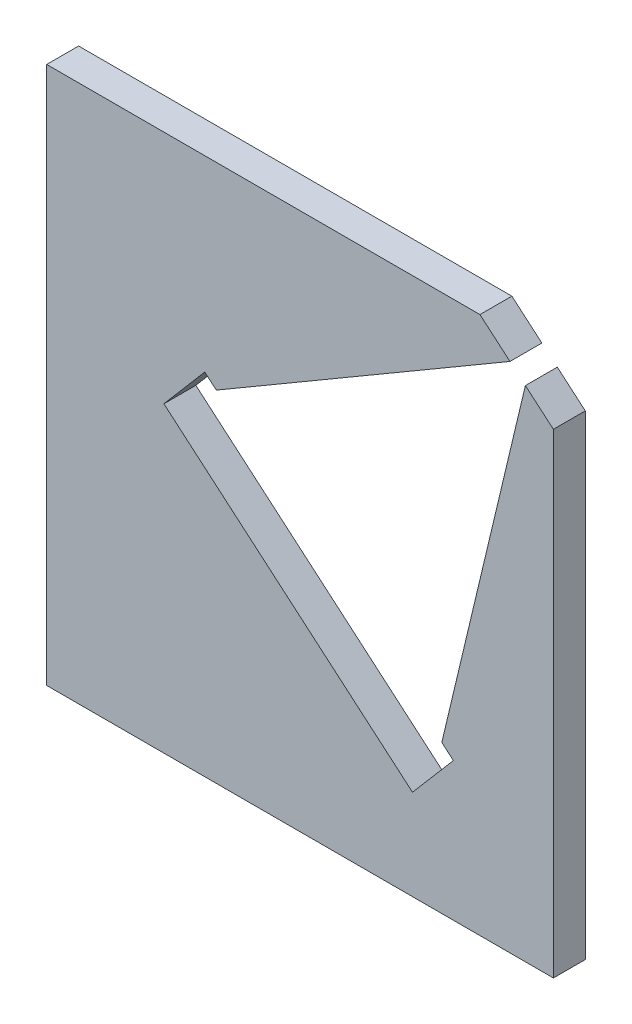
ISO-10303-21;
HEADER;
FILE_DESCRIPTION(('STEP AP214'),'2;1');
FILE_NAME('part.step','',(''),(''),'','','');
FILE_SCHEMA(('AUTOMOTIVE_DESIGN { 1 0 10303 214 1 1 1 1 }'));
ENDSEC;
DATA;
#1=APPLICATION_CONTEXT('core data for automotive mechanical design processes');
#2=APPLICATION_PROTOCOL_DEFINITION('international standard','automotive_design',2000,#1);
#3=PRODUCT_CONTEXT('',#1,'mechanical');
#4=PRODUCT('Part','Part','',(#3));
#5=PRODUCT_RELATED_PRODUCT_CATEGORY('part','',(#4));
#6=PRODUCT_DEFINITION_FORMATION('','',#4);
#7=PRODUCT_DEFINITION_CONTEXT('part definition',#1,'design');
#8=PRODUCT_DEFINITION('design','',#6,#7);
#9=PRODUCT_DEFINITION_SHAPE('','',#8);
#10=(LENGTH_UNIT() NAMED_UNIT(*) SI_UNIT(.MILLI.,.METRE.));
#11=(NAMED_UNIT(*) PLANE_ANGLE_UNIT() SI_UNIT($,.RADIAN.));
#12=(NAMED_UNIT(*) SI_UNIT($,.STERADIAN.) SOLID_ANGLE_UNIT());
#13=UNCERTAINTY_MEASURE_WITH_UNIT(LENGTH_MEASURE(1.E-05),#10,'distance_accuracy_value','');
#14=(GEOMETRIC_REPRESENTATION_CONTEXT(3) GLOBAL_UNCERTAINTY_ASSIGNED_CONTEXT((#13)) GLOBAL_UNIT_ASSIGNED_CONTEXT((#10,
#11,#12)) REPRESENTATION_CONTEXT('',''));
#15=CARTESIAN_POINT('',(0.,0.,0.));
#16=DIRECTION('',(0.,0.,1.));
#17=DIRECTION('',(1.,0.,0.));
#18=AXIS2_PLACEMENT_3D('',#15,#16,#17);
#19=CARTESIAN_POINT('',(-16.9070586646256,14.4255603185175,1.6));
#20=DIRECTION('',(0.760726555216218,-0.649072498407432,0.));
#21=DIRECTION('',(0.649072498407432,0.760726555216218,0.));
#22=AXIS2_PLACEMENT_3D('',#19,#20,#21);
#23=PLANE('',#22);
#24=DIRECTION('',(0.,0.,1.));
#25=VECTOR('',#24,1.);
#26=CARTESIAN_POINT('',(-19.5249627160686,11.3573219694467,0.));
#27=LINE('',#26,#25);
#28=CARTESIAN_POINT('',(-19.5249627160686,11.3573219694467,0.));
#29=VERTEX_POINT('',#28);
#30=CARTESIAN_POINT('',(-19.5249627160686,11.3573219694467,1.6));
#31=VERTEX_POINT('',#30);
#32=EDGE_CURVE('E178',#29,#31,#27,.T.);
#33=ORIENTED_EDGE('',*,*,#32,.F.);
#34=DIRECTION('',(-0.649072498407432,-0.760726555216218,0.));
#35=VECTOR('',#34,1.);
#36=CARTESIAN_POINT('',(-16.9070586646256,14.4255603185175,0.));
#37=LINE('',#36,#35);
#38=CARTESIAN_POINT('',(-17.4764899110948,13.7581749777091,0.));
#39=VERTEX_POINT('',#38);
#40=EDGE_CURVE('E128',#39,#29,#37,.T.);
#41=ORIENTED_EDGE('',*,*,#40,.F.);
#42=DIRECTION('',(0.,0.,-1.));
#43=VECTOR('',#42,1.);
#44=CARTESIAN_POINT('',(-17.4764899110948,13.7581749777091,1.6));
#45=LINE('',#44,#43);
#46=CARTESIAN_POINT('',(-17.4764899110948,13.7581749777091,1.6));
#47=VERTEX_POINT('',#46);
#48=EDGE_CURVE('E11',#47,#39,#45,.T.);
#49=ORIENTED_EDGE('',*,*,#48,.F.);
#50=DIRECTION('',(-0.649072498407432,-0.760726555216218,0.));
#51=VECTOR('',#50,1.);
#52=CARTESIAN_POINT('',(-16.9070586646256,14.4255603185175,1.6));
#53=LINE('',#52,#51);
#54=EDGE_CURVE('E57',#47,#31,#53,.T.);
#55=ORIENTED_EDGE('',*,*,#54,.T.);
#56=EDGE_LOOP('',(#33,#41,#49,#55));
#57=FACE_BOUND('',#56,.T.);
#58=ADVANCED_FACE('F35',(#57),#23,.T.);
#59=CARTESIAN_POINT('',(-0.569431246469168,-0.667385340808344,1.6));
#60=DIRECTION('',(0.649072498407432,0.760726555216218,0.));
#61=DIRECTION('',(-0.760726555216218,0.649072498407432,0.));
#62=AXIS2_PLACEMENT_3D('',#59,#60,#61);
#63=PLANE('',#62);
#64=DIRECTION('',(0.760726555216218,-0.649072498407432,0.));
#65=VECTOR('',#64,1.);
#66=CARTESIAN_POINT('',(-0.569431246469168,-0.667385340808344,0.));
#67=LINE('',#66,#65);
#68=CARTESIAN_POINT('',(-16.8968162760199,13.2635817339226,0.));
#69=VERTEX_POINT('',#68);
#70=EDGE_CURVE('E177',#39,#69,#67,.T.);
#71=ORIENTED_EDGE('',*,*,#70,.T.);
#72=DIRECTION('',(0.,0.,-1.));
#73=VECTOR('',#72,1.);
#74=CARTESIAN_POINT('',(-16.8968162760199,13.2635817339226,1.6));
#75=LINE('',#74,#73);
#76=CARTESIAN_POINT('',(-16.8968162760199,13.2635817339226,1.6));
#77=VERTEX_POINT('',#76);
#78=EDGE_CURVE('E42',#77,#69,#75,.T.);
#79=ORIENTED_EDGE('',*,*,#78,.F.);
#80=DIRECTION('',(0.760726555216218,-0.649072498407432,0.));
#81=VECTOR('',#80,1.);
#82=CARTESIAN_POINT('',(-0.569431246469168,-0.667385340808344,1.6));
#83=LINE('',#82,#81);
#84=EDGE_CURVE('E132',#47,#77,#83,.T.);
#85=ORIENTED_EDGE('',*,*,#84,.F.);
#86=ORIENTED_EDGE('',*,*,#48,.T.);
#87=EDGE_LOOP('',(#71,#79,#85,#86));
#88=FACE_BOUND('',#87,.T.);
#89=ADVANCED_FACE('F133',(#88),#63,.F.);
#90=CARTESIAN_POINT('',(-10.0821377347925,17.2472125624994,1.6));
#91=DIRECTION('',(-0.504664949432859,0.863315289343314,0.));
#92=DIRECTION('',(-0.863315289343314,-0.504664949432859,0.));
#93=AXIS2_PLACEMENT_3D('',#90,#91,#92);
#94=PLANE('',#93);
#95=DIRECTION('',(0.863315289343314,0.504664949432859,0.));
#96=VECTOR('',#95,1.);
#97=CARTESIAN_POINT('',(-10.0821377347925,17.2472125624994,0.));
#98=LINE('',#97,#96);
#99=CARTESIAN_POINT('',(-2.17615103939343,21.8687852661235,0.));
#100=VERTEX_POINT('',#99);
#101=EDGE_CURVE('E180',#69,#100,#98,.T.);
#102=ORIENTED_EDGE('',*,*,#101,.T.);
#103=DIRECTION('',(0.,0.,-1.));
#104=VECTOR('',#103,1.);
#105=CARTESIAN_POINT('',(-2.17615103939343,21.8687852661235,1.6));
#106=LINE('',#105,#104);
#107=CARTESIAN_POINT('',(-2.17615103939343,21.8687852661235,1.6));
#108=VERTEX_POINT('',#107);
#109=EDGE_CURVE('E222',#108,#100,#106,.T.);
#110=ORIENTED_EDGE('',*,*,#109,.F.);
#111=DIRECTION('',(0.863315289343314,0.504664949432859,0.));
#112=VECTOR('',#111,1.);
#113=CARTESIAN_POINT('',(-10.0821377347925,17.2472125624994,1.6));
#114=LINE('',#113,#112);
#115=EDGE_CURVE('E137',#77,#108,#114,.T.);
#116=ORIENTED_EDGE('',*,*,#115,.F.);
#117=ORIENTED_EDGE('',*,*,#78,.T.);
#118=EDGE_LOOP('',(#102,#110,#116,#117));
#119=FACE_BOUND('',#118,.T.);
#120=ADVANCED_FACE('F225',(#119),#94,.F.);
#121=CARTESIAN_POINT('',(9.88127583572877,11.5810621249534,1.6));
#122=DIRECTION('',(0.649072498407433,0.760726555216218,0.));
#123=DIRECTION('',(-0.760726555216218,0.649072498407433,0.));
#124=AXIS2_PLACEMENT_3D('',#121,#122,#123);
#125=PLANE('',#124);
#126=DIRECTION('',(0.760726555216218,-0.649072498407433,0.));
#127=VECTOR('',#126,1.);
#128=CARTESIAN_POINT('',(9.88127583572877,11.5810621249534,0.));
#129=LINE('',#128,#127);
#130=CARTESIAN_POINT('',(-3.68039896283339,23.1522503314568,0.));
#131=VERTEX_POINT('',#130);
#132=EDGE_CURVE('E183',#131,#100,#129,.T.);
#133=ORIENTED_EDGE('',*,*,#132,.F.);
#134=DIRECTION('',(0.,0.,-1.));
#135=VECTOR('',#134,1.);
#136=CARTESIAN_POINT('',(-3.68039896283339,23.1522503314568,1.6));
#137=LINE('',#136,#135);
#138=CARTESIAN_POINT('',(-3.68039896283339,23.1522503314568,1.6));
#139=VERTEX_POINT('',#138);
#140=EDGE_CURVE('E220',#139,#131,#137,.T.);
#141=ORIENTED_EDGE('',*,*,#140,.F.);
#142=DIRECTION('',(0.760726555216218,-0.649072498407433,0.));
#143=VECTOR('',#142,1.);
#144=CARTESIAN_POINT('',(9.88127583572877,11.5810621249534,1.6));
#145=LINE('',#144,#143);
#146=EDGE_CURVE('E151',#139,#108,#145,.T.);
#147=ORIENTED_EDGE('',*,*,#146,.T.);
#148=ORIENTED_EDGE('',*,*,#109,.T.);
#149=EDGE_LOOP('',(#133,#141,#147,#148));
#150=FACE_BOUND('',#149,.T.);
#151=ADVANCED_FACE('F233',(#150),#125,.T.);
#152=CARTESIAN_POINT('',(0.,23.1522503314568,1.6));
#153=DIRECTION('',(0.,-1.,0.));
#154=DIRECTION('',(1.,0.,0.));
#155=AXIS2_PLACEMENT_3D('',#152,#153,#154);
#156=PLANE('',#155);
#157=DIRECTION('',(-1.,0.,0.));
#158=VECTOR('',#157,1.);
#159=CARTESIAN_POINT('',(0.,23.1522503314568,0.));
#160=LINE('',#159,#158);
#161=CARTESIAN_POINT('',(-25.4,23.1522503314568,0.));
#162=VERTEX_POINT('',#161);
#163=EDGE_CURVE('E186',#131,#162,#160,.T.);
#164=ORIENTED_EDGE('',*,*,#163,.T.);
#165=DIRECTION('',(0.,0.,-1.));
#166=VECTOR('',#165,1.);
#167=CARTESIAN_POINT('',(-25.4,23.1522503314568,1.6));
#168=LINE('',#167,#166);
#169=CARTESIAN_POINT('',(-25.4,23.1522503314568,1.6));
#170=VERTEX_POINT('',#169);
#171=EDGE_CURVE('E218',#170,#162,#168,.T.);
#172=ORIENTED_EDGE('',*,*,#171,.F.);
#173=DIRECTION('',(-1.,0.,0.));
#174=VECTOR('',#173,1.);
#175=CARTESIAN_POINT('',(0.,23.1522503314568,1.6));
#176=LINE('',#175,#174);
#177=EDGE_CURVE('E154',#139,#170,#176,.T.);
#178=ORIENTED_EDGE('',*,*,#177,.F.);
#179=ORIENTED_EDGE('',*,*,#140,.T.);
#180=EDGE_LOOP('',(#164,#172,#178,#179));
#181=FACE_BOUND('',#180,.T.);
#182=ADVANCED_FACE('F239',(#181),#156,.F.);
#183=CARTESIAN_POINT('',(-25.4,0.,1.6));
#184=DIRECTION('',(-1.,0.,0.));
#185=DIRECTION('',(0.,0.,1.));
#186=AXIS2_PLACEMENT_3D('',#183,#184,#185);
#187=PLANE('',#186);
#188=DIRECTION('',(0.,1.,0.));
#189=VECTOR('',#188,1.);
#190=CARTESIAN_POINT('',(-25.4,0.,0.));
#191=LINE('',#190,#189);
#192=CARTESIAN_POINT('',(-25.4,-3.81,0.));
#193=VERTEX_POINT('',#192);
#194=EDGE_CURVE('E189',#193,#162,#191,.T.);
#195=ORIENTED_EDGE('',*,*,#194,.F.);
#196=DIRECTION('',(0.,0.,-1.));
#197=VECTOR('',#196,1.);
#198=CARTESIAN_POINT('',(-25.4,-3.81,1.6));
#199=LINE('',#198,#197);
#200=CARTESIAN_POINT('',(-25.4,-3.81,1.6));
#201=VERTEX_POINT('',#200);
#202=EDGE_CURVE('E216',#201,#193,#199,.T.);
#203=ORIENTED_EDGE('',*,*,#202,.F.);
#204=DIRECTION('',(0.,1.,0.));
#205=VECTOR('',#204,1.);
#206=CARTESIAN_POINT('',(-25.4,0.,1.6));
#207=LINE('',#206,#205);
#208=EDGE_CURVE('E156',#201,#170,#207,.T.);
#209=ORIENTED_EDGE('',*,*,#208,.T.);
#210=ORIENTED_EDGE('',*,*,#171,.T.);
#211=EDGE_LOOP('',(#195,#203,#209,#210));
#212=FACE_BOUND('',#211,.T.);
#213=ADVANCED_FACE('F242',(#212),#187,.T.);
#214=CARTESIAN_POINT('',(0.,-3.81,1.6));
#215=DIRECTION('',(0.,1.,0.));
#216=DIRECTION('',(0.,0.,1.));
#217=AXIS2_PLACEMENT_3D('',#214,#215,#216);
#218=PLANE('',#217);
#219=DIRECTION('',(1.,0.,0.));
#220=VECTOR('',#219,1.);
#221=CARTESIAN_POINT('',(0.,-3.81,0.));
#222=LINE('',#221,#220);
#223=CARTESIAN_POINT('',(0.,-3.81,0.));
#224=VERTEX_POINT('',#223);
#225=EDGE_CURVE('E192',#193,#224,#222,.T.);
#226=ORIENTED_EDGE('',*,*,#225,.T.);
#227=DIRECTION('',(0.,0.,-1.));
#228=VECTOR('',#227,1.);
#229=CARTESIAN_POINT('',(0.,-3.81,1.6));
#230=LINE('',#229,#228);
#231=CARTESIAN_POINT('',(0.,-3.81,1.6));
#232=VERTEX_POINT('',#231);
#233=EDGE_CURVE('E214',#232,#224,#230,.T.);
#234=ORIENTED_EDGE('',*,*,#233,.F.);
#235=DIRECTION('',(1.,0.,0.));
#236=VECTOR('',#235,1.);
#237=CARTESIAN_POINT('',(0.,-3.81,1.6));
#238=LINE('',#237,#236);
#239=EDGE_CURVE('E159',#201,#232,#238,.T.);
#240=ORIENTED_EDGE('',*,*,#239,.F.);
#241=ORIENTED_EDGE('',*,*,#202,.T.);
#242=EDGE_LOOP('',(#226,#234,#240,#241));
#243=FACE_BOUND('',#242,.T.);
#244=ADVANCED_FACE('F247',(#243),#218,.F.);
#245=CARTESIAN_POINT('',(0.,0.,1.6));
#246=DIRECTION('',(1.,0.,0.));
#247=DIRECTION('',(0.,0.,-1.));
#248=AXIS2_PLACEMENT_3D('',#245,#246,#247);
#249=PLANE('',#248);
#250=DIRECTION('',(0.,-1.,0.));
#251=VECTOR('',#250,1.);
#252=CARTESIAN_POINT('',(0.,0.,0.));
#253=LINE('',#252,#251);
#254=CARTESIAN_POINT('',(0.,20.0120342662198,0.));
#255=VERTEX_POINT('',#254);
#256=EDGE_CURVE('E195',#255,#224,#253,.T.);
#257=ORIENTED_EDGE('',*,*,#256,.F.);
#258=DIRECTION('',(0.,0.,-1.));
#259=VECTOR('',#258,1.);
#260=CARTESIAN_POINT('',(0.,20.0120342662198,1.6));
#261=LINE('',#260,#259);
#262=CARTESIAN_POINT('',(0.,20.0120342662198,1.6));
#263=VERTEX_POINT('',#262);
#264=EDGE_CURVE('E212',#263,#255,#261,.T.);
#265=ORIENTED_EDGE('',*,*,#264,.F.);
#266=DIRECTION('',(0.,-1.,0.));
#267=VECTOR('',#266,1.);
#268=CARTESIAN_POINT('',(0.,0.,1.6));
#269=LINE('',#268,#267);
#270=EDGE_CURVE('E161',#263,#232,#269,.T.);
#271=ORIENTED_EDGE('',*,*,#270,.T.);
#272=ORIENTED_EDGE('',*,*,#233,.T.);
#273=EDGE_LOOP('',(#257,#265,#271,#272));
#274=FACE_BOUND('',#273,.T.);
#275=ADVANCED_FACE('F271',(#274),#249,.T.);
#276=CARTESIAN_POINT('',(9.88127583572877,11.5810621249534,1.6));
#277=DIRECTION('',(0.649072498407433,0.760726555216218,0.));
#278=DIRECTION('',(-0.760726555216218,0.649072498407433,0.));
#279=AXIS2_PLACEMENT_3D('',#276,#277,#278);
#280=PLANE('',#279);
#281=DIRECTION('',(0.760726555216218,-0.649072498407432,0.));
#282=VECTOR('',#281,1.);
#283=CARTESIAN_POINT('',(9.88127583572877,11.5810621249534,0.));
#284=LINE('',#283,#282);
#285=CARTESIAN_POINT('',(-1.40325285929376,21.2093276077416,0.));
#286=VERTEX_POINT('',#285);
#287=EDGE_CURVE('E198',#286,#255,#284,.T.);
#288=ORIENTED_EDGE('',*,*,#287,.F.);
#289=DIRECTION('',(0.,0.,-1.));
#290=VECTOR('',#289,1.);
#291=CARTESIAN_POINT('',(-1.40325285929376,21.2093276077416,1.6));
#292=LINE('',#291,#290);
#293=CARTESIAN_POINT('',(-1.40325285929376,21.2093276077416,1.6));
#294=VERTEX_POINT('',#293);
#295=EDGE_CURVE('E210',#294,#286,#292,.T.);
#296=ORIENTED_EDGE('',*,*,#295,.F.);
#297=DIRECTION('',(0.760726555216218,-0.649072498407432,0.));
#298=VECTOR('',#297,1.);
#299=CARTESIAN_POINT('',(9.88127583572877,11.5810621249534,1.6));
#300=LINE('',#299,#298);
#301=EDGE_CURVE('E164',#294,#263,#300,.T.);
#302=ORIENTED_EDGE('',*,*,#301,.T.);
#303=ORIENTED_EDGE('',*,*,#264,.T.);
#304=EDGE_LOOP('',(#288,#296,#302,#303));
#305=FACE_BOUND('',#304,.T.);
#306=ADVANCED_FACE('F254',(#305),#280,.T.);
#307=CARTESIAN_POINT('',(-6.10862710626384,1.45504535701903,1.6));
#308=DIRECTION('',(-0.972784310430269,0.231712505878958,0.));
#309=DIRECTION('',(-0.231712505878958,-0.972784310430269,0.));
#310=AXIS2_PLACEMENT_3D('',#307,#308,#309);
#311=PLANE('',#310);
#312=DIRECTION('',(0.231712505878958,0.972784310430269,0.));
#313=VECTOR('',#312,1.);
#314=CARTESIAN_POINT('',(-6.10862710626384,1.45504535701903,0.));
#315=LINE('',#314,#313);
#316=CARTESIAN_POINT('',(-5.59318039206222,3.61901348008663,0.));
#317=VERTEX_POINT('',#316);
#318=EDGE_CURVE('E201',#317,#286,#315,.T.);
#319=ORIENTED_EDGE('',*,*,#318,.F.);
#320=DIRECTION('',(0.,0.,-1.));
#321=VECTOR('',#320,1.);
#322=CARTESIAN_POINT('',(-5.59318039206222,3.61901348008663,1.6));
#323=LINE('',#322,#321);
#324=CARTESIAN_POINT('',(-5.59318039206222,3.61901348008663,1.6));
#325=VERTEX_POINT('',#324);
#326=EDGE_CURVE('E208',#325,#317,#323,.T.);
#327=ORIENTED_EDGE('',*,*,#326,.F.);
#328=DIRECTION('',(0.231712505878958,0.972784310430269,0.));
#329=VECTOR('',#328,1.);
#330=CARTESIAN_POINT('',(-6.10862710626384,1.45504535701903,1.6));
#331=LINE('',#330,#329);
#332=EDGE_CURVE('E167',#325,#294,#331,.T.);
#333=ORIENTED_EDGE('',*,*,#332,.T.);
#334=ORIENTED_EDGE('',*,*,#295,.T.);
#335=EDGE_LOOP('',(#319,#327,#333,#334));
#336=FACE_BOUND('',#335,.T.);
#337=ADVANCED_FACE('F258',(#336),#311,.T.);
#338=CARTESIAN_POINT('',(-0.569431246469138,-0.667385340808316,1.6));
#339=DIRECTION('',(-0.649072498407428,-0.760726555216222,0.));
#340=DIRECTION('',(0.760726555216222,-0.649072498407428,0.));
#341=AXIS2_PLACEMENT_3D('',#338,#339,#340);
#342=PLANE('',#341);
#343=DIRECTION('',(-0.760726555216222,0.649072498407428,0.));
#344=VECTOR('',#343,1.);
#345=CARTESIAN_POINT('',(-0.569431246469138,-0.667385340808316,0.));
#346=LINE('',#345,#344);
#347=CARTESIAN_POINT('',(-5.01350675698745,3.12442023630016,0.));
#348=VERTEX_POINT('',#347);
#349=EDGE_CURVE('E145',#348,#317,#346,.T.);
#350=ORIENTED_EDGE('',*,*,#349,.F.);
#351=DIRECTION('',(0.,0.,-1.));
#352=VECTOR('',#351,1.);
#353=CARTESIAN_POINT('',(-5.01350675698745,3.12442023630016,1.6));
#354=LINE('',#353,#352);
#355=CARTESIAN_POINT('',(-5.01350675698745,3.12442023630016,1.6));
#356=VERTEX_POINT('',#355);
#357=EDGE_CURVE('E175',#356,#348,#354,.T.);
#358=ORIENTED_EDGE('',*,*,#357,.F.);
#359=DIRECTION('',(-0.760726555216222,0.649072498407428,0.));
#360=VECTOR('',#359,1.);
#361=CARTESIAN_POINT('',(-0.569431246469138,-0.667385340808316,1.6));
#362=LINE('',#361,#360);
#363=EDGE_CURVE('E170',#356,#325,#362,.T.);
#364=ORIENTED_EDGE('',*,*,#363,.T.);
#365=ORIENTED_EDGE('',*,*,#326,.T.);
#366=EDGE_LOOP('',(#350,#358,#364,#365));
#367=FACE_BOUND('',#366,.T.);
#368=ADVANCED_FACE('F263',(#367),#342,.T.);
#369=CARTESIAN_POINT('',(-4.4440755105183,3.7918055771085,1.6));
#370=DIRECTION('',(-0.760726555216218,0.649072498407432,0.));
#371=DIRECTION('',(-0.649072498407432,-0.760726555216219,0.));
#372=AXIS2_PLACEMENT_3D('',#369,#370,#371);
#373=PLANE('',#372);
#374=DIRECTION('',(0.,0.,1.));
#375=VECTOR('',#374,1.);
#376=CARTESIAN_POINT('',(-7.06197956196132,0.723567228037768,0.));
#377=LINE('',#376,#375);
#378=CARTESIAN_POINT('',(-7.06197956196132,0.723567228037768,0.));
#379=VERTEX_POINT('',#378);
#380=CARTESIAN_POINT('',(-7.06197956196132,0.723567228037768,1.6));
#381=VERTEX_POINT('',#380);
#382=EDGE_CURVE('E49',#379,#381,#377,.T.);
#383=ORIENTED_EDGE('',*,*,#382,.T.);
#384=DIRECTION('',(0.649072498407432,0.760726555216219,0.));
#385=VECTOR('',#384,1.);
#386=CARTESIAN_POINT('',(-4.4440755105183,3.7918055771085,1.6));
#387=LINE('',#386,#385);
#388=EDGE_CURVE('E173',#381,#356,#387,.T.);
#389=ORIENTED_EDGE('',*,*,#388,.T.);
#390=ORIENTED_EDGE('',*,*,#357,.T.);
#391=DIRECTION('',(0.649072498407432,0.760726555216219,0.));
#392=VECTOR('',#391,1.);
#393=CARTESIAN_POINT('',(-4.4440755105183,3.7918055771085,0.));
#394=LINE('',#393,#392);
#395=EDGE_CURVE('E143',#379,#348,#394,.T.);
#396=ORIENTED_EDGE('',*,*,#395,.F.);
#397=EDGE_LOOP('',(#383,#389,#390,#396));
#398=FACE_BOUND('',#397,.T.);
#399=ADVANCED_FACE('F264',(#398),#373,.T.);
#400=CARTESIAN_POINT('',(0.,0.,1.6));
#401=DIRECTION('',(0.,0.,1.));
#402=DIRECTION('',(1.,0.,0.));
#403=AXIS2_PLACEMENT_3D('',#400,#401,#402);
#404=PLANE('',#403);
#405=ORIENTED_EDGE('',*,*,#388,.F.);
#406=DIRECTION('',(-0.760726555216219,0.649072498407431,0.));
#407=VECTOR('',#406,1.);
#408=CARTESIAN_POINT('',(-19.5249627160686,11.3573219694467,1.6));
#409=LINE('',#408,#407);
#410=EDGE_CURVE('E142',#381,#31,#409,.T.);
#411=ORIENTED_EDGE('',*,*,#410,.T.);
#412=ORIENTED_EDGE('',*,*,#54,.F.);
#413=ORIENTED_EDGE('',*,*,#84,.T.);
#414=ORIENTED_EDGE('',*,*,#115,.T.);
#415=ORIENTED_EDGE('',*,*,#146,.F.);
#416=ORIENTED_EDGE('',*,*,#177,.T.);
#417=ORIENTED_EDGE('',*,*,#208,.F.);
#418=ORIENTED_EDGE('',*,*,#239,.T.);
#419=ORIENTED_EDGE('',*,*,#270,.F.);
#420=ORIENTED_EDGE('',*,*,#301,.F.);
#421=ORIENTED_EDGE('',*,*,#332,.F.);
#422=ORIENTED_EDGE('',*,*,#363,.F.);
#423=EDGE_LOOP('',(#405,#411,#412,#413,#414,#415,#416,#417,#418,#419,#420,#421,#422));
#424=FACE_BOUND('',#423,.T.);
#425=ADVANCED_FACE('F140',(#424),#404,.T.);
#426=CARTESIAN_POINT('',(0.,0.,0.));
#427=DIRECTION('',(0.,0.,1.));
#428=DIRECTION('',(1.,0.,0.));
#429=AXIS2_PLACEMENT_3D('',#426,#427,#428);
#430=PLANE('',#429);
#431=DIRECTION('',(-0.760726555216219,0.649072498407431,0.));
#432=VECTOR('',#431,1.);
#433=CARTESIAN_POINT('',(-19.5249627160686,11.3573219694467,0.));
#434=LINE('',#433,#432);
#435=EDGE_CURVE('E268',#379,#29,#434,.T.);
#436=ORIENTED_EDGE('',*,*,#435,.F.);
#437=ORIENTED_EDGE('',*,*,#395,.T.);
#438=ORIENTED_EDGE('',*,*,#349,.T.);
#439=ORIENTED_EDGE('',*,*,#318,.T.);
#440=ORIENTED_EDGE('',*,*,#287,.T.);
#441=ORIENTED_EDGE('',*,*,#256,.T.);
#442=ORIENTED_EDGE('',*,*,#225,.F.);
#443=ORIENTED_EDGE('',*,*,#194,.T.);
#444=ORIENTED_EDGE('',*,*,#163,.F.);
#445=ORIENTED_EDGE('',*,*,#132,.T.);
#446=ORIENTED_EDGE('',*,*,#101,.F.);
#447=ORIENTED_EDGE('',*,*,#70,.F.);
#448=ORIENTED_EDGE('',*,*,#40,.T.);
#449=EDGE_LOOP('',(#436,#437,#438,#439,#440,#441,#442,#443,#444,#445,#446,#447,#448));
#450=FACE_BOUND('',#449,.T.);
#451=ADVANCED_FACE('F229',(#450),#430,.F.);
#452=CARTESIAN_POINT('',(-19.5249627160686,11.3573219694467,0.));
#453=DIRECTION('',(0.649072498407431,0.760726555216219,0.));
#454=DIRECTION('',(-0.760726555216219,0.649072498407431,0.));
#455=AXIS2_PLACEMENT_3D('',#452,#453,#454);
#456=PLANE('',#455);
#457=ORIENTED_EDGE('',*,*,#410,.F.);
#458=ORIENTED_EDGE('',*,*,#382,.F.);
#459=ORIENTED_EDGE('',*,*,#435,.T.);
#460=ORIENTED_EDGE('',*,*,#32,.T.);
#461=EDGE_LOOP('',(#457,#458,#459,#460));
#462=FACE_BOUND('',#461,.T.);
#463=ADVANCED_FACE('F266',(#462),#456,.T.);
#464=CLOSED_SHELL('',(#58,#89,#120,#151,#182,#213,#244,#275,#306,#337,#368,#399,#425,#451,#463));
#465=MANIFOLD_SOLID_BREP('B2',#464);
#466=ADVANCED_BREP_SHAPE_REPRESENTATION('',(#18,#465),#14);
#467=SHAPE_DEFINITION_REPRESENTATION(#9,#466);
ENDSEC;
END-ISO-10303-21;
